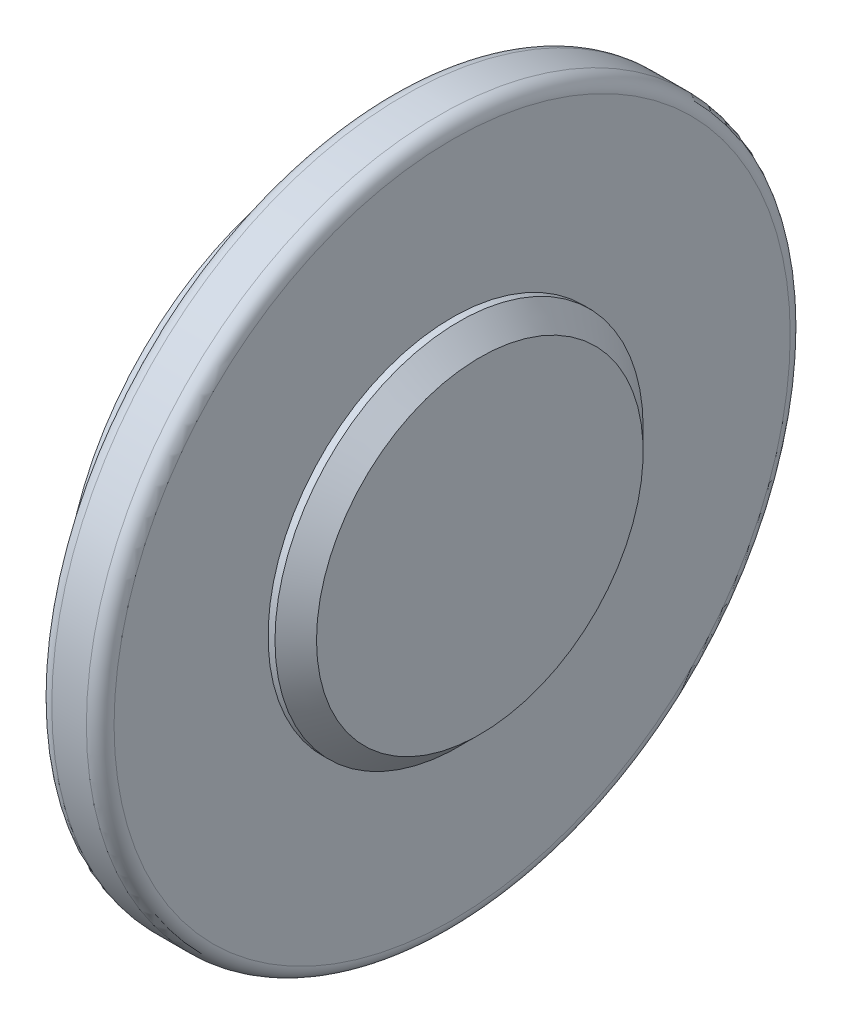
ISO-10303-21;
HEADER;
FILE_DESCRIPTION(('STEP AP214'),'2;1');
FILE_NAME('part.step','',(''),(''),'','','');
FILE_SCHEMA(('AUTOMOTIVE_DESIGN { 1 0 10303 214 1 1 1 1 }'));
ENDSEC;
DATA;
#1=APPLICATION_CONTEXT('core data for automotive mechanical design processes');
#2=APPLICATION_PROTOCOL_DEFINITION('international standard','automotive_design',2000,#1);
#3=PRODUCT_CONTEXT('',#1,'mechanical');
#4=PRODUCT('Part','Part','',(#3));
#5=PRODUCT_RELATED_PRODUCT_CATEGORY('part','',(#4));
#6=PRODUCT_DEFINITION_FORMATION('','',#4);
#7=PRODUCT_DEFINITION_CONTEXT('part definition',#1,'design');
#8=PRODUCT_DEFINITION('design','',#6,#7);
#9=PRODUCT_DEFINITION_SHAPE('','',#8);
#10=(LENGTH_UNIT() NAMED_UNIT(*) SI_UNIT(.MILLI.,.METRE.));
#11=(NAMED_UNIT(*) PLANE_ANGLE_UNIT() SI_UNIT($,.RADIAN.));
#12=(NAMED_UNIT(*) SI_UNIT($,.STERADIAN.) SOLID_ANGLE_UNIT());
#13=UNCERTAINTY_MEASURE_WITH_UNIT(LENGTH_MEASURE(1.E-05),#10,'distance_accuracy_value','');
#14=(GEOMETRIC_REPRESENTATION_CONTEXT(3) GLOBAL_UNCERTAINTY_ASSIGNED_CONTEXT((#13)) GLOBAL_UNIT_ASSIGNED_CONTEXT((#10,
#11,#12)) REPRESENTATION_CONTEXT('',''));
#15=CARTESIAN_POINT('',(0.,0.,0.));
#16=DIRECTION('',(0.,0.,1.));
#17=DIRECTION('',(1.,0.,0.));
#18=AXIS2_PLACEMENT_3D('',#15,#16,#17);
#19=CARTESIAN_POINT('',(40.3670000000001,0.6858,0.));
#20=DIRECTION('',(-1.,0.,0.));
#21=DIRECTION('',(0.,0.,1.));
#22=AXIS2_PLACEMENT_3D('',#19,#20,#21);
#23=PLANE('',#22);
#24=CARTESIAN_POINT('',(40.367,0.,0.));
#25=DIRECTION('',(1.,0.,0.));
#26=DIRECTION('',(0.,0.,1.));
#27=AXIS2_PLACEMENT_3D('',#24,#25,#26);
#28=CIRCLE('',#27,1.3716);
#29=CARTESIAN_POINT('',(40.367,0.,-1.37160000000001));
#30=VERTEX_POINT('',#29);
#31=CARTESIAN_POINT('',(40.367,0.,1.37160000000001));
#32=VERTEX_POINT('',#31);
#33=EDGE_CURVE('E68',#30,#32,#28,.F.);
#34=ORIENTED_EDGE('',*,*,#33,.T.);
#35=CARTESIAN_POINT('',(40.367,0.,0.));
#36=DIRECTION('',(1.,0.,0.));
#37=DIRECTION('',(0.,1.,0.));
#38=AXIS2_PLACEMENT_3D('',#35,#36,#37);
#39=CIRCLE('',#38,1.3716);
#40=CARTESIAN_POINT('',(40.367,1.3716,0.));
#41=VERTEX_POINT('',#40);
#42=EDGE_CURVE('E71',#32,#41,#39,.F.);
#43=ORIENTED_EDGE('',*,*,#42,.T.);
#44=CARTESIAN_POINT('',(40.367,0.,0.));
#45=DIRECTION('',(1.,0.,0.));
#46=DIRECTION('',(0.,0.,-1.));
#47=AXIS2_PLACEMENT_3D('',#44,#45,#46);
#48=CIRCLE('',#47,1.3716);
#49=EDGE_CURVE('E74',#41,#30,#48,.F.);
#50=ORIENTED_EDGE('',*,*,#49,.T.);
#51=EDGE_LOOP('',(#34,#43,#50));
#52=FACE_BOUND('',#51,.T.);
#53=ADVANCED_FACE('F17',(#52),#23,.T.);
#54=CARTESIAN_POINT('',(40.1130000000001,0.,0.));
#55=DIRECTION('',(-1.,0.,0.));
#56=DIRECTION('',(0.,0.,1.));
#57=AXIS2_PLACEMENT_3D('',#54,#55,#56);
#58=TOROIDAL_SURFACE('',#57,1.37160000000006,0.253999999999942);
#59=ORIENTED_EDGE('',*,*,#42,.F.);
#60=ORIENTED_EDGE('',*,*,#33,.F.);
#61=ORIENTED_EDGE('',*,*,#49,.F.);
#62=EDGE_LOOP('',(#59,#60,#61));
#63=FACE_BOUND('',#62,.T.);
#64=CARTESIAN_POINT('',(40.1130000000001,0.,0.));
#65=DIRECTION('',(1.,0.,0.));
#66=DIRECTION('',(0.,0.,-1.));
#67=AXIS2_PLACEMENT_3D('',#64,#65,#66);
#68=CIRCLE('',#67,1.6256);
#69=CARTESIAN_POINT('',(40.1130000000001,0.,-1.6256));
#70=VERTEX_POINT('',#69);
#71=EDGE_CURVE('E105',#70,#70,#68,.F.);
#72=ORIENTED_EDGE('',*,*,#71,.T.);
#73=EDGE_LOOP('',(#72));
#74=FACE_BOUND('',#73,.T.);
#75=ADVANCED_FACE('F80',(#63,#74),#58,.F.);
#76=CARTESIAN_POINT('',(39.7320000000001,0.,0.));
#77=DIRECTION('',(1.,0.,0.));
#78=DIRECTION('',(0.,0.,-1.));
#79=AXIS2_PLACEMENT_3D('',#76,#77,#78);
#80=CYLINDRICAL_SURFACE('',#79,1.6256);
#81=ORIENTED_EDGE('',*,*,#71,.F.);
#82=EDGE_LOOP('',(#81));
#83=FACE_BOUND('',#82,.T.);
#84=CARTESIAN_POINT('',(39.3509999999537,0.,0.));
#85=DIRECTION('',(-1.,0.,0.));
#86=DIRECTION('',(0.,1.,0.));
#87=AXIS2_PLACEMENT_3D('',#84,#85,#86);
#88=CIRCLE('',#87,1.62560000001122);
#89=CARTESIAN_POINT('',(39.3509999999537,1.62560000001122,0.));
#90=VERTEX_POINT('',#89);
#91=EDGE_CURVE('E115',#90,#90,#88,.T.);
#92=ORIENTED_EDGE('',*,*,#91,.T.);
#93=EDGE_LOOP('',(#92));
#94=FACE_BOUND('',#93,.T.);
#95=ADVANCED_FACE('F99',(#83,#94),#80,.F.);
#96=CARTESIAN_POINT('',(39.0970000000266,0.,0.));
#97=DIRECTION('',(-1.,0.,0.));
#98=DIRECTION('',(0.,0.,1.));
#99=AXIS2_PLACEMENT_3D('',#96,#97,#98);
#100=CONICAL_SURFACE('',#99,1.87959999993836,0.785398163397448);
#101=ORIENTED_EDGE('',*,*,#91,.F.);
#102=EDGE_LOOP('',(#101));
#103=FACE_BOUND('',#102,.T.);
#104=CARTESIAN_POINT('',(39.0969999999697,0.,0.));
#105=DIRECTION('',(-1.,0.,0.));
#106=DIRECTION('',(0.,0.,1.));
#107=AXIS2_PLACEMENT_3D('',#104,#105,#106);
#108=CIRCLE('',#107,1.87959999999521);
#109=CARTESIAN_POINT('',(39.0969999999697,0.,1.87959999999521));
#110=VERTEX_POINT('',#109);
#111=EDGE_CURVE('E118',#110,#110,#108,.F.);
#112=ORIENTED_EDGE('',*,*,#111,.F.);
#113=EDGE_LOOP('',(#112));
#114=FACE_BOUND('',#113,.T.);
#115=ADVANCED_FACE('F395',(#103,#114),#100,.F.);
#116=CARTESIAN_POINT('',(39.0970000000001,3.429,0.));
#117=DIRECTION('',(-1.,0.,0.));
#118=DIRECTION('',(0.,0.,1.));
#119=AXIS2_PLACEMENT_3D('',#116,#117,#118);
#120=PLANE('',#119);
#121=CARTESIAN_POINT('',(39.0970000000001,0.,0.));
#122=DIRECTION('',(-1.,0.,0.));
#123=DIRECTION('',(0.,0.,1.));
#124=AXIS2_PLACEMENT_3D('',#121,#122,#123);
#125=CIRCLE('',#124,4.97839999999999);
#126=CARTESIAN_POINT('',(39.0970000000001,0.,4.97839999999999));
#127=VERTEX_POINT('',#126);
#128=EDGE_CURVE('E248',#127,#127,#125,.T.);
#129=ORIENTED_EDGE('',*,*,#128,.T.);
#130=EDGE_LOOP('',(#129));
#131=FACE_BOUND('',#130,.T.);
#132=ORIENTED_EDGE('',*,*,#111,.T.);
#133=EDGE_LOOP('',(#132));
#134=FACE_BOUND('',#133,.T.);
#135=ADVANCED_FACE('F135',(#131,#134),#120,.T.);
#136=CARTESIAN_POINT('',(39.0969999999998,0.,0.));
#137=DIRECTION('',(-1.,0.,0.));
#138=DIRECTION('',(0.,0.,1.));
#139=AXIS2_PLACEMENT_3D('',#136,#137,#138);
#140=TOROIDAL_SURFACE('',#139,5.99440000000005,1.01600000000006);
#141=CARTESIAN_POINT('',(40.1129999999999,0.,0.));
#142=DIRECTION('',(-1.,0.,0.));
#143=DIRECTION('',(0.,0.,-1.));
#144=AXIS2_PLACEMENT_3D('',#141,#142,#143);
#145=CIRCLE('',#144,5.99440000000003);
#146=CARTESIAN_POINT('',(40.113,0.,5.99440000000001));
#147=VERTEX_POINT('',#146);
#148=CARTESIAN_POINT('',(40.113,0.,-5.99440000000001));
#149=VERTEX_POINT('',#148);
#150=EDGE_CURVE('E198',#147,#149,#145,.F.);
#151=ORIENTED_EDGE('',*,*,#150,.F.);
#152=CARTESIAN_POINT('',(40.1129999999999,0.,0.));
#153=DIRECTION('',(-1.,0.,0.));
#154=DIRECTION('',(0.,0.,1.));
#155=AXIS2_PLACEMENT_3D('',#152,#153,#154);
#156=CIRCLE('',#155,5.9944);
#157=CARTESIAN_POINT('',(40.113,5.9944,0.));
#158=VERTEX_POINT('',#157);
#159=EDGE_CURVE('E188',#158,#147,#156,.F.);
#160=ORIENTED_EDGE('',*,*,#159,.F.);
#161=CARTESIAN_POINT('',(40.1129999999999,0.,0.));
#162=DIRECTION('',(-1.,0.,0.));
#163=DIRECTION('',(0.,1.,0.));
#164=AXIS2_PLACEMENT_3D('',#161,#162,#163);
#165=CIRCLE('',#164,5.9944);
#166=EDGE_CURVE('E178',#149,#158,#165,.F.);
#167=ORIENTED_EDGE('',*,*,#166,.F.);
#168=EDGE_LOOP('',(#151,#160,#167));
#169=FACE_BOUND('',#168,.T.);
#170=ORIENTED_EDGE('',*,*,#128,.F.);
#171=EDGE_LOOP('',(#170));
#172=FACE_BOUND('',#171,.T.);
#173=ADVANCED_FACE('F124',(#169,#172),#140,.F.);
#174=CARTESIAN_POINT('',(40.1130000000001,6.099175,0.));
#175=DIRECTION('',(-1.,0.,0.));
#176=DIRECTION('',(0.,-1.,0.));
#177=AXIS2_PLACEMENT_3D('',#174,#175,#176);
#178=PLANE('',#177);
#179=CARTESIAN_POINT('',(40.1129999999999,0.,0.));
#180=DIRECTION('',(1.,0.,0.));
#181=DIRECTION('',(0.,0.,1.));
#182=AXIS2_PLACEMENT_3D('',#179,#180,#181);
#183=CIRCLE('',#182,6.20395);
#184=CARTESIAN_POINT('',(40.113,0.,6.20395000000001));
#185=VERTEX_POINT('',#184);
#186=CARTESIAN_POINT('',(40.113,0.,-6.20395000000001));
#187=VERTEX_POINT('',#186);
#188=EDGE_CURVE('E220',#185,#187,#183,.T.);
#189=ORIENTED_EDGE('',*,*,#188,.F.);
#190=CARTESIAN_POINT('',(40.1129999999999,0.,0.));
#191=DIRECTION('',(1.,0.,0.));
#192=DIRECTION('',(0.,1.,0.));
#193=AXIS2_PLACEMENT_3D('',#190,#191,#192);
#194=CIRCLE('',#193,6.20395);
#195=CARTESIAN_POINT('',(40.113,6.20395,0.));
#196=VERTEX_POINT('',#195);
#197=EDGE_CURVE('E172',#196,#185,#194,.T.);
#198=ORIENTED_EDGE('',*,*,#197,.F.);
#199=CARTESIAN_POINT('',(40.1129999999999,0.,0.));
#200=DIRECTION('',(1.,0.,0.));
#201=DIRECTION('',(0.,0.,-1.));
#202=AXIS2_PLACEMENT_3D('',#199,#200,#201);
#203=CIRCLE('',#202,6.20395);
#204=EDGE_CURVE('E210',#187,#196,#203,.T.);
#205=ORIENTED_EDGE('',*,*,#204,.F.);
#206=EDGE_LOOP('',(#189,#198,#205));
#207=FACE_BOUND('',#206,.T.);
#208=ORIENTED_EDGE('',*,*,#159,.T.);
#209=ORIENTED_EDGE('',*,*,#150,.T.);
#210=ORIENTED_EDGE('',*,*,#166,.T.);
#211=EDGE_LOOP('',(#208,#209,#210));
#212=FACE_BOUND('',#211,.T.);
#213=ADVANCED_FACE('F134',(#207,#212),#178,.T.);
#214=CARTESIAN_POINT('',(40.3669999999998,0.,0.));
#215=DIRECTION('',(-1.,0.,0.));
#216=DIRECTION('',(0.,0.,1.));
#217=AXIS2_PLACEMENT_3D('',#214,#215,#216);
#218=TOROIDAL_SURFACE('',#217,6.20395000000005,0.253999999999942);
#219=CARTESIAN_POINT('',(40.3670000000001,0.,0.));
#220=DIRECTION('',(1.,0.,0.));
#221=DIRECTION('',(0.,0.,-1.));
#222=AXIS2_PLACEMENT_3D('',#219,#220,#221);
#223=CIRCLE('',#222,6.45795);
#224=CARTESIAN_POINT('',(40.3670000000001,0.,-6.45795));
#225=VERTEX_POINT('',#224);
#226=EDGE_CURVE('E168',#225,#225,#223,.T.);
#227=ORIENTED_EDGE('',*,*,#226,.F.);
#228=EDGE_LOOP('',(#227));
#229=FACE_BOUND('',#228,.T.);
#230=ORIENTED_EDGE('',*,*,#204,.T.);
#231=ORIENTED_EDGE('',*,*,#197,.T.);
#232=ORIENTED_EDGE('',*,*,#188,.T.);
#233=EDGE_LOOP('',(#230,#231,#232));
#234=FACE_BOUND('',#233,.T.);
#235=ADVANCED_FACE('F148',(#229,#234),#218,.T.);
#236=CARTESIAN_POINT('',(41.7640000000001,1.4986,0.));
#237=DIRECTION('',(1.,0.,0.));
#238=DIRECTION('',(0.,0.,-1.));
#239=AXIS2_PLACEMENT_3D('',#236,#237,#238);
#240=PLANE('',#239);
#241=CARTESIAN_POINT('',(41.7640000000574,0.,0.));
#242=DIRECTION('',(-1.,0.,0.));
#243=DIRECTION('',(0.,0.,1.));
#244=AXIS2_PLACEMENT_3D('',#241,#242,#243);
#245=CIRCLE('',#244,2.99720000003845);
#246=CARTESIAN_POINT('',(41.7640000000574,0.,2.99720000003845));
#247=VERTEX_POINT('',#246);
#248=EDGE_CURVE('E171',#247,#247,#245,.T.);
#249=ORIENTED_EDGE('',*,*,#248,.F.);
#250=EDGE_LOOP('',(#249));
#251=FACE_BOUND('',#250,.T.);
#252=ADVANCED_FACE('F158',(#251),#240,.T.);
#253=CARTESIAN_POINT('',(40.6845000000001,0.,0.));
#254=DIRECTION('',(1.,0.,0.));
#255=DIRECTION('',(0.,0.,-1.));
#256=AXIS2_PLACEMENT_3D('',#253,#254,#255);
#257=CYLINDRICAL_SURFACE('',#256,6.45795);
#258=CARTESIAN_POINT('',(41.0020000000001,0.,0.));
#259=DIRECTION('',(-1.,0.,0.));
#260=DIRECTION('',(0.,0.,1.));
#261=AXIS2_PLACEMENT_3D('',#258,#259,#260);
#262=CIRCLE('',#261,6.45794999999999);
#263=CARTESIAN_POINT('',(41.0020000000001,0.,6.45794999999999));
#264=VERTEX_POINT('',#263);
#265=EDGE_CURVE('E166',#264,#264,#262,.F.);
#266=ORIENTED_EDGE('',*,*,#265,.F.);
#267=EDGE_LOOP('',(#266));
#268=FACE_BOUND('',#267,.T.);
#269=ORIENTED_EDGE('',*,*,#226,.T.);
#270=EDGE_LOOP('',(#269));
#271=FACE_BOUND('',#270,.T.);
#272=ADVANCED_FACE('F306',(#268,#271),#257,.T.);
#273=CARTESIAN_POINT('',(41.3830000001099,0.,0.));
#274=DIRECTION('',(-1.,0.,0.));
#275=DIRECTION('',(0.,0.,1.));
#276=AXIS2_PLACEMENT_3D('',#273,#274,#275);
#277=CONICAL_SURFACE('',#276,3.37819999992917,0.785398163322851);
#278=CARTESIAN_POINT('',(41.3830000000001,0.,0.));
#279=DIRECTION('',(1.,0.,0.));
#280=DIRECTION('',(0.,0.,-1.));
#281=AXIS2_PLACEMENT_3D('',#278,#279,#280);
#282=CIRCLE('',#281,3.3782);
#283=CARTESIAN_POINT('',(41.3830000000001,0.,-3.3782));
#284=VERTEX_POINT('',#283);
#285=EDGE_CURVE('E289',#284,#284,#282,.F.);
#286=ORIENTED_EDGE('',*,*,#285,.F.);
#287=EDGE_LOOP('',(#286));
#288=FACE_BOUND('',#287,.T.);
#289=ORIENTED_EDGE('',*,*,#248,.T.);
#290=EDGE_LOOP('',(#289));
#291=FACE_BOUND('',#290,.T.);
#292=ADVANCED_FACE('F276',(#288,#291),#277,.T.);
#293=CARTESIAN_POINT('',(41.0020000000001,0.,0.));
#294=DIRECTION('',(-1.,0.,0.));
#295=DIRECTION('',(0.,0.,1.));
#296=AXIS2_PLACEMENT_3D('',#293,#294,#295);
#297=TOROIDAL_SURFACE('',#296,6.20395000000005,0.253999999999942);
#298=ORIENTED_EDGE('',*,*,#265,.T.);
#299=EDGE_LOOP('',(#298));
#300=FACE_BOUND('',#299,.T.);
#301=CARTESIAN_POINT('',(41.256,0.,0.));
#302=DIRECTION('',(-1.,0.,0.));
#303=DIRECTION('',(0.,0.,-1.));
#304=AXIS2_PLACEMENT_3D('',#301,#302,#303);
#305=CIRCLE('',#304,6.20395000000003);
#306=CARTESIAN_POINT('',(41.256,0.,6.20395000000002));
#307=VERTEX_POINT('',#306);
#308=CARTESIAN_POINT('',(41.256,0.,-6.20395000000001));
#309=VERTEX_POINT('',#308);
#310=EDGE_CURVE('E28',#307,#309,#305,.F.);
#311=ORIENTED_EDGE('',*,*,#310,.F.);
#312=CARTESIAN_POINT('',(41.256,0.,0.));
#313=DIRECTION('',(-1.,0.,0.));
#314=DIRECTION('',(0.,0.,1.));
#315=AXIS2_PLACEMENT_3D('',#312,#313,#314);
#316=CIRCLE('',#315,6.20395000000003);
#317=CARTESIAN_POINT('',(41.256,6.20395000000001,0.));
#318=VERTEX_POINT('',#317);
#319=EDGE_CURVE('E257',#318,#307,#316,.F.);
#320=ORIENTED_EDGE('',*,*,#319,.F.);
#321=CARTESIAN_POINT('',(41.256,0.,0.));
#322=DIRECTION('',(-1.,0.,0.));
#323=DIRECTION('',(0.,1.,0.));
#324=AXIS2_PLACEMENT_3D('',#321,#322,#323);
#325=CIRCLE('',#324,6.20395);
#326=EDGE_CURVE('E296',#309,#318,#325,.F.);
#327=ORIENTED_EDGE('',*,*,#326,.F.);
#328=EDGE_LOOP('',(#311,#320,#327));
#329=FACE_BOUND('',#328,.T.);
#330=ADVANCED_FACE('F264',(#300,#329),#297,.T.);
#331=CARTESIAN_POINT('',(41.3195000000001,0.,0.));
#332=DIRECTION('',(1.,0.,0.));
#333=DIRECTION('',(0.,0.,-1.));
#334=AXIS2_PLACEMENT_3D('',#331,#332,#333);
#335=CYLINDRICAL_SURFACE('',#334,3.3782);
#336=CARTESIAN_POINT('',(41.2560000000001,0.,0.));
#337=DIRECTION('',(1.,0.,0.));
#338=DIRECTION('',(0.,0.,-1.));
#339=AXIS2_PLACEMENT_3D('',#336,#337,#338);
#340=CIRCLE('',#339,3.3782);
#341=CARTESIAN_POINT('',(41.2560000000001,0.,-3.3782));
#342=VERTEX_POINT('',#341);
#343=EDGE_CURVE('E11',#342,#342,#340,.F.);
#344=ORIENTED_EDGE('',*,*,#343,.F.);
#345=EDGE_LOOP('',(#344));
#346=FACE_BOUND('',#345,.T.);
#347=ORIENTED_EDGE('',*,*,#285,.T.);
#348=EDGE_LOOP('',(#347));
#349=FACE_BOUND('',#348,.T.);
#350=ADVANCED_FACE('F275',(#346,#349),#335,.T.);
#351=CARTESIAN_POINT('',(41.2560000000001,4.791075,0.));
#352=DIRECTION('',(1.,0.,0.));
#353=DIRECTION('',(0.,0.,-1.));
#354=AXIS2_PLACEMENT_3D('',#351,#352,#353);
#355=PLANE('',#354);
#356=ORIENTED_EDGE('',*,*,#343,.T.);
#357=EDGE_LOOP('',(#356));
#358=FACE_BOUND('',#357,.T.);
#359=ORIENTED_EDGE('',*,*,#319,.T.);
#360=ORIENTED_EDGE('',*,*,#310,.T.);
#361=ORIENTED_EDGE('',*,*,#326,.T.);
#362=EDGE_LOOP('',(#359,#360,#361));
#363=FACE_BOUND('',#362,.T.);
#364=ADVANCED_FACE('F312',(#358,#363),#355,.T.);
#365=CLOSED_SHELL('',(#53,#75,#95,#115,#135,#173,#213,#235,#252,#272,#292,#330,#350,#364));
#366=MANIFOLD_SOLID_BREP('B1',#365);
#367=ADVANCED_BREP_SHAPE_REPRESENTATION('',(#18,#366),#14);
#368=SHAPE_DEFINITION_REPRESENTATION(#9,#367);
ENDSEC;
END-ISO-10303-21;
